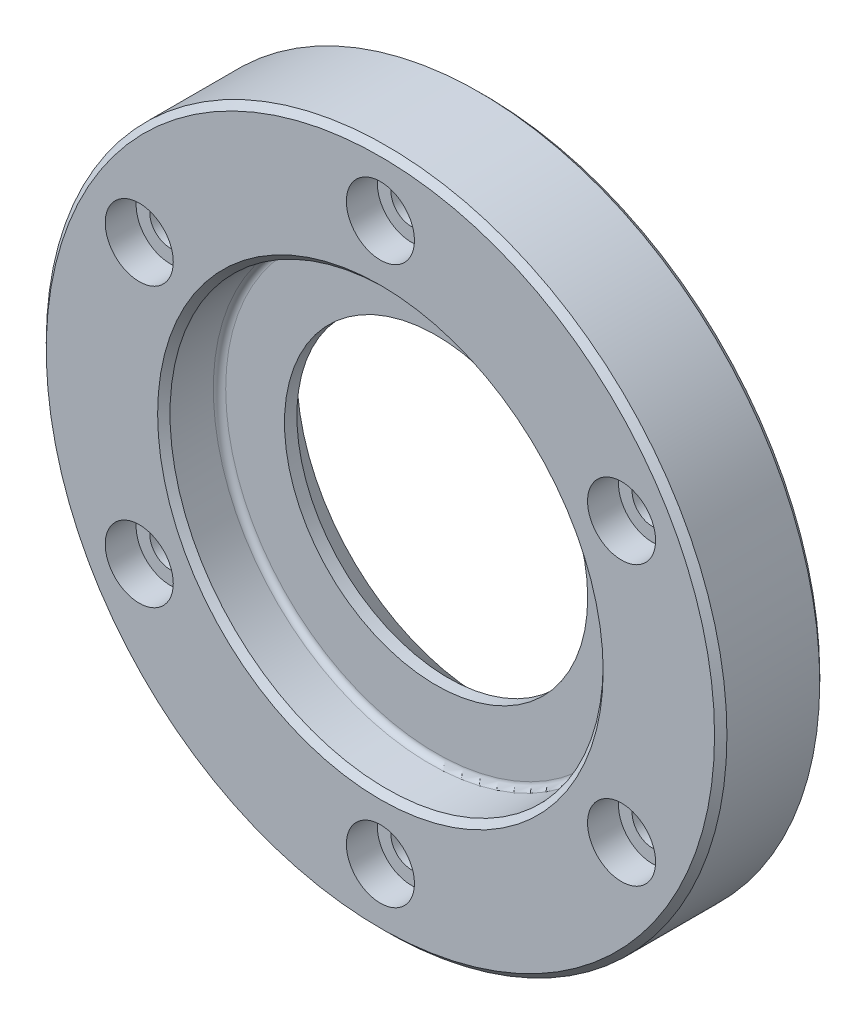
ISO-10303-21;
HEADER;
FILE_DESCRIPTION(('STEP AP214'),'2;1');
FILE_NAME('part.step','',(''),(''),'','','');
FILE_SCHEMA(('AUTOMOTIVE_DESIGN { 1 0 10303 214 1 1 1 1 }'));
ENDSEC;
DATA;
#1=APPLICATION_CONTEXT('core data for automotive mechanical design processes');
#2=APPLICATION_PROTOCOL_DEFINITION('international standard','automotive_design',2000,#1);
#3=PRODUCT_CONTEXT('',#1,'mechanical');
#4=PRODUCT('Part','Part','',(#3));
#5=PRODUCT_RELATED_PRODUCT_CATEGORY('part','',(#4));
#6=PRODUCT_DEFINITION_FORMATION('','',#4);
#7=PRODUCT_DEFINITION_CONTEXT('part definition',#1,'design');
#8=PRODUCT_DEFINITION('design','',#6,#7);
#9=PRODUCT_DEFINITION_SHAPE('','',#8);
#10=(LENGTH_UNIT() NAMED_UNIT(*) SI_UNIT(.MILLI.,.METRE.));
#11=(NAMED_UNIT(*) PLANE_ANGLE_UNIT() SI_UNIT($,.RADIAN.));
#12=(NAMED_UNIT(*) SI_UNIT($,.STERADIAN.) SOLID_ANGLE_UNIT());
#13=UNCERTAINTY_MEASURE_WITH_UNIT(LENGTH_MEASURE(1.E-05),#10,'distance_accuracy_value','');
#14=(GEOMETRIC_REPRESENTATION_CONTEXT(3) GLOBAL_UNCERTAINTY_ASSIGNED_CONTEXT((#13)) GLOBAL_UNIT_ASSIGNED_CONTEXT((#10,
#11,#12)) REPRESENTATION_CONTEXT('',''));
#15=CARTESIAN_POINT('',(0.,0.,0.));
#16=DIRECTION('',(0.,0.,1.));
#17=DIRECTION('',(1.,0.,0.));
#18=AXIS2_PLACEMENT_3D('',#15,#16,#17);
#19=CARTESIAN_POINT('',(0.,54.,0.));
#20=DIRECTION('',(0.,0.,-1.));
#21=DIRECTION('',(-1.,0.,0.));
#22=AXIS2_PLACEMENT_3D('',#19,#20,#21);
#23=PLANE('',#22);
#24=CARTESIAN_POINT('',(0.,-45.,0.));
#25=DIRECTION('',(0.,0.,1.));
#26=DIRECTION('',(1.,0.,0.));
#27=AXIS2_PLACEMENT_3D('',#24,#25,#26);
#28=CIRCLE('',#27,5.5);
#29=CARTESIAN_POINT('',(5.5,-45.,0.));
#30=VERTEX_POINT('',#29);
#31=EDGE_CURVE('E155',#30,#30,#28,.T.);
#32=ORIENTED_EDGE('',*,*,#31,.F.);
#33=EDGE_LOOP('',(#32));
#34=FACE_BOUND('',#33,.T.);
#35=CARTESIAN_POINT('',(-38.9711431702998,22.4999999999999,0.));
#36=DIRECTION('',(0.,0.,1.));
#37=DIRECTION('',(1.,0.,0.));
#38=AXIS2_PLACEMENT_3D('',#35,#36,#37);
#39=CIRCLE('',#38,5.5);
#40=CARTESIAN_POINT('',(-33.4711431702998,22.4999999999999,0.));
#41=VERTEX_POINT('',#40);
#42=EDGE_CURVE('E123',#41,#41,#39,.T.);
#43=ORIENTED_EDGE('',*,*,#42,.F.);
#44=EDGE_LOOP('',(#43));
#45=FACE_BOUND('',#44,.T.);
#46=CARTESIAN_POINT('',(0.,0.,0.));
#47=DIRECTION('',(0.,0.,1.));
#48=DIRECTION('',(1.,0.,0.));
#49=AXIS2_PLACEMENT_3D('',#46,#47,#48);
#50=CIRCLE('',#49,36.);
#51=CARTESIAN_POINT('',(36.,0.,0.));
#52=VERTEX_POINT('',#51);
#53=EDGE_CURVE('E61',#52,#52,#50,.T.);
#54=ORIENTED_EDGE('',*,*,#53,.F.);
#55=EDGE_LOOP('',(#54));
#56=FACE_BOUND('',#55,.T.);
#57=CARTESIAN_POINT('',(0.,0.,0.));
#58=DIRECTION('',(0.,0.,1.));
#59=DIRECTION('',(1.,0.,0.));
#60=AXIS2_PLACEMENT_3D('',#57,#58,#59);
#61=CIRCLE('',#60,54.);
#62=CARTESIAN_POINT('',(54.,0.,0.));
#63=VERTEX_POINT('',#62);
#64=EDGE_CURVE('E67',#63,#63,#61,.T.);
#65=ORIENTED_EDGE('',*,*,#64,.T.);
#66=EDGE_LOOP('',(#65));
#67=FACE_BOUND('',#66,.T.);
#68=CARTESIAN_POINT('',(0.,45.,0.));
#69=DIRECTION('',(0.,0.,1.));
#70=DIRECTION('',(1.,0.,0.));
#71=AXIS2_PLACEMENT_3D('',#68,#69,#70);
#72=CIRCLE('',#71,5.5);
#73=CARTESIAN_POINT('',(5.5,45.,0.));
#74=VERTEX_POINT('',#73);
#75=EDGE_CURVE('E107',#74,#74,#72,.T.);
#76=ORIENTED_EDGE('',*,*,#75,.F.);
#77=EDGE_LOOP('',(#76));
#78=FACE_BOUND('',#77,.T.);
#79=CARTESIAN_POINT('',(-38.9711431702996,-22.5000000000002,0.));
#80=DIRECTION('',(0.,0.,1.));
#81=DIRECTION('',(1.,0.,0.));
#82=AXIS2_PLACEMENT_3D('',#79,#80,#81);
#83=CIRCLE('',#82,5.5);
#84=CARTESIAN_POINT('',(-33.4711431702996,-22.5000000000002,0.));
#85=VERTEX_POINT('',#84);
#86=EDGE_CURVE('E139',#85,#85,#83,.T.);
#87=ORIENTED_EDGE('',*,*,#86,.F.);
#88=EDGE_LOOP('',(#87));
#89=FACE_BOUND('',#88,.T.);
#90=CARTESIAN_POINT('',(38.9711431702999,-22.4999999999996,0.));
#91=DIRECTION('',(0.,0.,1.));
#92=DIRECTION('',(1.,0.,0.));
#93=AXIS2_PLACEMENT_3D('',#90,#91,#92);
#94=CIRCLE('',#93,5.5);
#95=CARTESIAN_POINT('',(44.4711431702999,-22.4999999999996,0.));
#96=VERTEX_POINT('',#95);
#97=EDGE_CURVE('E171',#96,#96,#94,.T.);
#98=ORIENTED_EDGE('',*,*,#97,.F.);
#99=EDGE_LOOP('',(#98));
#100=FACE_BOUND('',#99,.T.);
#101=CARTESIAN_POINT('',(38.9711431702995,22.5000000000005,0.));
#102=DIRECTION('',(0.,0.,1.));
#103=DIRECTION('',(1.,0.,0.));
#104=AXIS2_PLACEMENT_3D('',#101,#102,#103);
#105=CIRCLE('',#104,5.5);
#106=CARTESIAN_POINT('',(44.4711431702995,22.5000000000005,0.));
#107=VERTEX_POINT('',#106);
#108=EDGE_CURVE('E187',#107,#107,#105,.T.);
#109=ORIENTED_EDGE('',*,*,#108,.F.);
#110=EDGE_LOOP('',(#109));
#111=FACE_BOUND('',#110,.T.);
#112=ADVANCED_FACE('F43',(#34,#45,#56,#67,#78,#89,#100,#111),#23,.F.);
#113=CARTESIAN_POINT('',(0.,34.,-9.00000000000001));
#114=DIRECTION('',(0.,0.,-1.));
#115=DIRECTION('',(-1.,0.,0.));
#116=AXIS2_PLACEMENT_3D('',#113,#114,#115);
#117=PLANE('',#116);
#118=CARTESIAN_POINT('',(0.,0.,-9.00000000000001));
#119=DIRECTION('',(0.,0.,1.));
#120=DIRECTION('',(1.,0.,0.));
#121=AXIS2_PLACEMENT_3D('',#118,#119,#120);
#122=CIRCLE('',#121,24.5);
#123=CARTESIAN_POINT('',(24.5,0.,-9.00000000000001));
#124=VERTEX_POINT('',#123);
#125=EDGE_CURVE('E91',#124,#124,#122,.T.);
#126=ORIENTED_EDGE('',*,*,#125,.F.);
#127=EDGE_LOOP('',(#126));
#128=FACE_BOUND('',#127,.T.);
#129=CARTESIAN_POINT('',(0.,0.,-9.00000000000001));
#130=DIRECTION('',(0.,0.,1.));
#131=DIRECTION('',(1.,0.,0.));
#132=AXIS2_PLACEMENT_3D('',#129,#130,#131);
#133=CIRCLE('',#132,34.);
#134=CARTESIAN_POINT('',(34.,0.,-9.00000000000001));
#135=VERTEX_POINT('',#134);
#136=EDGE_CURVE('E10',#135,#135,#133,.T.);
#137=ORIENTED_EDGE('',*,*,#136,.T.);
#138=EDGE_LOOP('',(#137));
#139=FACE_BOUND('',#138,.T.);
#140=ADVANCED_FACE('F45',(#128,#139),#117,.F.);
#141=CARTESIAN_POINT('',(0.,0.,-8.00000000000001));
#142=DIRECTION('',(0.,0.,1.));
#143=DIRECTION('',(1.,0.,0.));
#144=AXIS2_PLACEMENT_3D('',#141,#142,#143);
#145=TOROIDAL_SURFACE('',#144,34.,1.);
#146=ORIENTED_EDGE('',*,*,#136,.F.);
#147=EDGE_LOOP('',(#146));
#148=FACE_BOUND('',#147,.T.);
#149=CARTESIAN_POINT('',(0.,0.,-8.));
#150=DIRECTION('',(0.,0.,1.));
#151=DIRECTION('',(1.,0.,0.));
#152=AXIS2_PLACEMENT_3D('',#149,#150,#151);
#153=CIRCLE('',#152,35.);
#154=CARTESIAN_POINT('',(35.,0.,-8.));
#155=VERTEX_POINT('',#154);
#156=EDGE_CURVE('E51',#155,#155,#153,.T.);
#157=ORIENTED_EDGE('',*,*,#156,.T.);
#158=EDGE_LOOP('',(#157));
#159=FACE_BOUND('',#158,.T.);
#160=ADVANCED_FACE('F200',(#148,#159),#145,.F.);
#161=CARTESIAN_POINT('',(0.,0.,0.));
#162=DIRECTION('',(0.,0.,1.));
#163=DIRECTION('',(1.,0.,0.));
#164=AXIS2_PLACEMENT_3D('',#161,#162,#163);
#165=CYLINDRICAL_SURFACE('',#164,35.);
#166=ORIENTED_EDGE('',*,*,#156,.F.);
#167=EDGE_LOOP('',(#166));
#168=FACE_BOUND('',#167,.T.);
#169=CARTESIAN_POINT('',(0.,0.,-1.));
#170=DIRECTION('',(0.,0.,1.));
#171=DIRECTION('',(1.,0.,0.));
#172=AXIS2_PLACEMENT_3D('',#169,#170,#171);
#173=CIRCLE('',#172,35.);
#174=CARTESIAN_POINT('',(35.,0.,-1.));
#175=VERTEX_POINT('',#174);
#176=EDGE_CURVE('E56',#175,#175,#173,.T.);
#177=ORIENTED_EDGE('',*,*,#176,.T.);
#178=EDGE_LOOP('',(#177));
#179=FACE_BOUND('',#178,.T.);
#180=ADVANCED_FACE('F211',(#168,#179),#165,.F.);
#181=CARTESIAN_POINT('',(0.,0.,0.));
#182=DIRECTION('',(0.,0.,1.));
#183=DIRECTION('',(1.,0.,0.));
#184=AXIS2_PLACEMENT_3D('',#181,#182,#183);
#185=CONICAL_SURFACE('',#184,36.,0.785398163397449);
#186=ORIENTED_EDGE('',*,*,#176,.F.);
#187=EDGE_LOOP('',(#186));
#188=FACE_BOUND('',#187,.T.);
#189=ORIENTED_EDGE('',*,*,#53,.T.);
#190=EDGE_LOOP('',(#189));
#191=FACE_BOUND('',#190,.T.);
#192=ADVANCED_FACE('F208',(#188,#191),#185,.F.);
#193=CARTESIAN_POINT('',(0.,0.,-1.));
#194=DIRECTION('',(0.,0.,-1.));
#195=DIRECTION('',(-1.,0.,0.));
#196=AXIS2_PLACEMENT_3D('',#193,#194,#195);
#197=CONICAL_SURFACE('',#196,55.,0.785398163397449);
#198=ORIENTED_EDGE('',*,*,#64,.F.);
#199=EDGE_LOOP('',(#198));
#200=FACE_BOUND('',#199,.T.);
#201=CARTESIAN_POINT('',(0.,0.,-1.));
#202=DIRECTION('',(0.,0.,1.));
#203=DIRECTION('',(1.,0.,0.));
#204=AXIS2_PLACEMENT_3D('',#201,#202,#203);
#205=CIRCLE('',#204,55.);
#206=CARTESIAN_POINT('',(55.,0.,-1.));
#207=VERTEX_POINT('',#206);
#208=EDGE_CURVE('E71',#207,#207,#205,.T.);
#209=ORIENTED_EDGE('',*,*,#208,.T.);
#210=EDGE_LOOP('',(#209));
#211=FACE_BOUND('',#210,.T.);
#212=ADVANCED_FACE('F206',(#200,#211),#197,.T.);
#213=CARTESIAN_POINT('',(0.,0.,0.));
#214=DIRECTION('',(0.,0.,1.));
#215=DIRECTION('',(1.,0.,0.));
#216=AXIS2_PLACEMENT_3D('',#213,#214,#215);
#217=CYLINDRICAL_SURFACE('',#216,55.);
#218=ORIENTED_EDGE('',*,*,#208,.F.);
#219=EDGE_LOOP('',(#218));
#220=FACE_BOUND('',#219,.T.);
#221=CARTESIAN_POINT('',(0.,0.,-16.));
#222=DIRECTION('',(0.,0.,1.));
#223=DIRECTION('',(1.,0.,0.));
#224=AXIS2_PLACEMENT_3D('',#221,#222,#223);
#225=CIRCLE('',#224,55.);
#226=CARTESIAN_POINT('',(55.,0.,-16.));
#227=VERTEX_POINT('',#226);
#228=EDGE_CURVE('E75',#227,#227,#225,.T.);
#229=ORIENTED_EDGE('',*,*,#228,.T.);
#230=EDGE_LOOP('',(#229));
#231=FACE_BOUND('',#230,.T.);
#232=ADVANCED_FACE('F236',(#220,#231),#217,.T.);
#233=CARTESIAN_POINT('',(0.,0.,-17.));
#234=DIRECTION('',(0.,0.,1.));
#235=DIRECTION('',(1.,0.,0.));
#236=AXIS2_PLACEMENT_3D('',#233,#234,#235);
#237=CONICAL_SURFACE('',#236,54.,0.785398163397448);
#238=ORIENTED_EDGE('',*,*,#228,.F.);
#239=EDGE_LOOP('',(#238));
#240=FACE_BOUND('',#239,.T.);
#241=CARTESIAN_POINT('',(0.,0.,-17.));
#242=DIRECTION('',(0.,0.,1.));
#243=DIRECTION('',(1.,0.,0.));
#244=AXIS2_PLACEMENT_3D('',#241,#242,#243);
#245=CIRCLE('',#244,54.);
#246=CARTESIAN_POINT('',(54.,0.,-17.));
#247=VERTEX_POINT('',#246);
#248=EDGE_CURVE('E79',#247,#247,#245,.T.);
#249=ORIENTED_EDGE('',*,*,#248,.T.);
#250=EDGE_LOOP('',(#249));
#251=FACE_BOUND('',#250,.T.);
#252=ADVANCED_FACE('F243',(#240,#251),#237,.T.);
#253=CARTESIAN_POINT('',(0.,30.5,-17.));
#254=DIRECTION('',(0.,0.,1.));
#255=DIRECTION('',(1.,0.,0.));
#256=AXIS2_PLACEMENT_3D('',#253,#254,#255);
#257=PLANE('',#256);
#258=CARTESIAN_POINT('',(38.9711431702995,22.5000000000005,-17.));
#259=DIRECTION('',(0.,0.,1.));
#260=DIRECTION('',(1.,0.,0.));
#261=AXIS2_PLACEMENT_3D('',#258,#259,#260);
#262=CIRCLE('',#261,3.3);
#263=CARTESIAN_POINT('',(42.2711431702995,22.5000000000005,-17.));
#264=VERTEX_POINT('',#263);
#265=EDGE_CURVE('E175',#264,#264,#262,.T.);
#266=ORIENTED_EDGE('',*,*,#265,.T.);
#267=EDGE_LOOP('',(#266));
#268=FACE_BOUND('',#267,.T.);
#269=CARTESIAN_POINT('',(38.9711431702999,-22.4999999999996,-17.));
#270=DIRECTION('',(0.,0.,1.));
#271=DIRECTION('',(1.,0.,0.));
#272=AXIS2_PLACEMENT_3D('',#269,#270,#271);
#273=CIRCLE('',#272,3.3);
#274=CARTESIAN_POINT('',(42.2711431703,-22.4999999999996,-17.));
#275=VERTEX_POINT('',#274);
#276=EDGE_CURVE('E159',#275,#275,#273,.T.);
#277=ORIENTED_EDGE('',*,*,#276,.T.);
#278=EDGE_LOOP('',(#277));
#279=FACE_BOUND('',#278,.T.);
#280=CARTESIAN_POINT('',(0.,-45.,-17.));
#281=DIRECTION('',(0.,0.,1.));
#282=DIRECTION('',(1.,0.,0.));
#283=AXIS2_PLACEMENT_3D('',#280,#281,#282);
#284=CIRCLE('',#283,3.3);
#285=CARTESIAN_POINT('',(3.3,-45.,-17.));
#286=VERTEX_POINT('',#285);
#287=EDGE_CURVE('E143',#286,#286,#284,.T.);
#288=ORIENTED_EDGE('',*,*,#287,.T.);
#289=EDGE_LOOP('',(#288));
#290=FACE_BOUND('',#289,.T.);
#291=CARTESIAN_POINT('',(-38.9711431702996,-22.5000000000002,-17.));
#292=DIRECTION('',(0.,0.,1.));
#293=DIRECTION('',(1.,0.,0.));
#294=AXIS2_PLACEMENT_3D('',#291,#292,#293);
#295=CIRCLE('',#294,3.3);
#296=CARTESIAN_POINT('',(-35.6711431702996,-22.5000000000002,-17.));
#297=VERTEX_POINT('',#296);
#298=EDGE_CURVE('E127',#297,#297,#295,.T.);
#299=ORIENTED_EDGE('',*,*,#298,.T.);
#300=EDGE_LOOP('',(#299));
#301=FACE_BOUND('',#300,.T.);
#302=CARTESIAN_POINT('',(-38.9711431702998,22.4999999999999,-17.));
#303=DIRECTION('',(0.,0.,1.));
#304=DIRECTION('',(1.,0.,0.));
#305=AXIS2_PLACEMENT_3D('',#302,#303,#304);
#306=CIRCLE('',#305,3.3);
#307=CARTESIAN_POINT('',(-35.6711431702998,22.4999999999999,-17.));
#308=VERTEX_POINT('',#307);
#309=EDGE_CURVE('E111',#308,#308,#306,.T.);
#310=ORIENTED_EDGE('',*,*,#309,.T.);
#311=EDGE_LOOP('',(#310));
#312=FACE_BOUND('',#311,.T.);
#313=CARTESIAN_POINT('',(0.,45.,-17.));
#314=DIRECTION('',(0.,0.,1.));
#315=DIRECTION('',(1.,0.,0.));
#316=AXIS2_PLACEMENT_3D('',#313,#314,#315);
#317=CIRCLE('',#316,3.3);
#318=CARTESIAN_POINT('',(3.3,45.,-17.));
#319=VERTEX_POINT('',#318);
#320=EDGE_CURVE('E95',#319,#319,#317,.T.);
#321=ORIENTED_EDGE('',*,*,#320,.T.);
#322=EDGE_LOOP('',(#321));
#323=FACE_BOUND('',#322,.T.);
#324=ORIENTED_EDGE('',*,*,#248,.F.);
#325=EDGE_LOOP('',(#324));
#326=FACE_BOUND('',#325,.T.);
#327=CARTESIAN_POINT('',(0.,0.,-17.));
#328=DIRECTION('',(0.,0.,1.));
#329=DIRECTION('',(1.,0.,0.));
#330=AXIS2_PLACEMENT_3D('',#327,#328,#329);
#331=CIRCLE('',#330,30.5);
#332=CARTESIAN_POINT('',(30.5,0.,-17.));
#333=VERTEX_POINT('',#332);
#334=EDGE_CURVE('E83',#333,#333,#331,.T.);
#335=ORIENTED_EDGE('',*,*,#334,.T.);
#336=EDGE_LOOP('',(#335));
#337=FACE_BOUND('',#336,.T.);
#338=ADVANCED_FACE('F251',(#268,#279,#290,#301,#312,#323,#326,#337),#257,.F.);
#339=CARTESIAN_POINT('',(0.,0.,-11.));
#340=DIRECTION('',(0.,0.,-1.));
#341=DIRECTION('',(-1.,0.,0.));
#342=AXIS2_PLACEMENT_3D('',#339,#340,#341);
#343=CONICAL_SURFACE('',#342,24.5,0.785398163397448);
#344=ORIENTED_EDGE('',*,*,#334,.F.);
#345=EDGE_LOOP('',(#344));
#346=FACE_BOUND('',#345,.T.);
#347=CARTESIAN_POINT('',(0.,0.,-11.));
#348=DIRECTION('',(0.,0.,1.));
#349=DIRECTION('',(1.,0.,0.));
#350=AXIS2_PLACEMENT_3D('',#347,#348,#349);
#351=CIRCLE('',#350,24.5);
#352=CARTESIAN_POINT('',(24.5,0.,-11.));
#353=VERTEX_POINT('',#352);
#354=EDGE_CURVE('E87',#353,#353,#351,.T.);
#355=ORIENTED_EDGE('',*,*,#354,.T.);
#356=EDGE_LOOP('',(#355));
#357=FACE_BOUND('',#356,.T.);
#358=ADVANCED_FACE('F259',(#346,#357),#343,.F.);
#359=CARTESIAN_POINT('',(0.,0.,0.));
#360=DIRECTION('',(0.,0.,1.));
#361=DIRECTION('',(1.,0.,0.));
#362=AXIS2_PLACEMENT_3D('',#359,#360,#361);
#363=CYLINDRICAL_SURFACE('',#362,24.5);
#364=ORIENTED_EDGE('',*,*,#354,.F.);
#365=EDGE_LOOP('',(#364));
#366=FACE_BOUND('',#365,.T.);
#367=ORIENTED_EDGE('',*,*,#125,.T.);
#368=EDGE_LOOP('',(#367));
#369=FACE_BOUND('',#368,.T.);
#370=ADVANCED_FACE('F266',(#366,#369),#363,.F.);
#371=CARTESIAN_POINT('',(0.,45.,0.));
#372=DIRECTION('',(0.,0.,1.));
#373=DIRECTION('',(1.,0.,0.));
#374=AXIS2_PLACEMENT_3D('',#371,#372,#373);
#375=CYLINDRICAL_SURFACE('',#374,3.3);
#376=ORIENTED_EDGE('',*,*,#320,.F.);
#377=EDGE_LOOP('',(#376));
#378=FACE_BOUND('',#377,.T.);
#379=CARTESIAN_POINT('',(0.,45.,-5.));
#380=DIRECTION('',(0.,0.,1.));
#381=DIRECTION('',(1.,0.,0.));
#382=AXIS2_PLACEMENT_3D('',#379,#380,#381);
#383=CIRCLE('',#382,3.30000000000001);
#384=CARTESIAN_POINT('',(3.30000000000001,45.,-5.));
#385=VERTEX_POINT('',#384);
#386=EDGE_CURVE('E99',#385,#385,#383,.T.);
#387=ORIENTED_EDGE('',*,*,#386,.T.);
#388=EDGE_LOOP('',(#387));
#389=FACE_BOUND('',#388,.T.);
#390=ADVANCED_FACE('F274',(#378,#389),#375,.F.);
#391=CARTESIAN_POINT('',(3.30000000000001,45.,-5.));
#392=DIRECTION('',(0.,0.,-1.));
#393=DIRECTION('',(-1.,0.,0.));
#394=AXIS2_PLACEMENT_3D('',#391,#392,#393);
#395=PLANE('',#394);
#396=ORIENTED_EDGE('',*,*,#386,.F.);
#397=EDGE_LOOP('',(#396));
#398=FACE_BOUND('',#397,.T.);
#399=CARTESIAN_POINT('',(0.,45.,-5.));
#400=DIRECTION('',(0.,0.,1.));
#401=DIRECTION('',(1.,0.,0.));
#402=AXIS2_PLACEMENT_3D('',#399,#400,#401);
#403=CIRCLE('',#402,5.5);
#404=CARTESIAN_POINT('',(5.5,45.,-5.));
#405=VERTEX_POINT('',#404);
#406=EDGE_CURVE('E103',#405,#405,#403,.T.);
#407=ORIENTED_EDGE('',*,*,#406,.T.);
#408=EDGE_LOOP('',(#407));
#409=FACE_BOUND('',#408,.T.);
#410=ADVANCED_FACE('F282',(#398,#409),#395,.F.);
#411=CARTESIAN_POINT('',(0.,45.,0.));
#412=DIRECTION('',(0.,0.,1.));
#413=DIRECTION('',(1.,0.,0.));
#414=AXIS2_PLACEMENT_3D('',#411,#412,#413);
#415=CYLINDRICAL_SURFACE('',#414,5.5);
#416=ORIENTED_EDGE('',*,*,#406,.F.);
#417=EDGE_LOOP('',(#416));
#418=FACE_BOUND('',#417,.T.);
#419=ORIENTED_EDGE('',*,*,#75,.T.);
#420=EDGE_LOOP('',(#419));
#421=FACE_BOUND('',#420,.T.);
#422=ADVANCED_FACE('F290',(#418,#421),#415,.F.);
#423=CARTESIAN_POINT('',(-38.9711431702998,22.4999999999999,0.));
#424=DIRECTION('',(0.,0.,1.));
#425=DIRECTION('',(1.,0.,0.));
#426=AXIS2_PLACEMENT_3D('',#423,#424,#425);
#427=CYLINDRICAL_SURFACE('',#426,3.3);
#428=ORIENTED_EDGE('',*,*,#309,.F.);
#429=EDGE_LOOP('',(#428));
#430=FACE_BOUND('',#429,.T.);
#431=CARTESIAN_POINT('',(-38.9711431702998,22.4999999999999,-5.));
#432=DIRECTION('',(0.,0.,1.));
#433=DIRECTION('',(1.,0.,0.));
#434=AXIS2_PLACEMENT_3D('',#431,#432,#433);
#435=CIRCLE('',#434,3.3);
#436=CARTESIAN_POINT('',(-35.6711431702998,22.4999999999999,-5.));
#437=VERTEX_POINT('',#436);
#438=EDGE_CURVE('E115',#437,#437,#435,.T.);
#439=ORIENTED_EDGE('',*,*,#438,.T.);
#440=EDGE_LOOP('',(#439));
#441=FACE_BOUND('',#440,.T.);
#442=ADVANCED_FACE('F298',(#430,#441),#427,.F.);
#443=CARTESIAN_POINT('',(-35.6711431702998,22.4999999999999,-5.));
#444=DIRECTION('',(0.,0.,-1.));
#445=DIRECTION('',(-1.,0.,0.));
#446=AXIS2_PLACEMENT_3D('',#443,#444,#445);
#447=PLANE('',#446);
#448=ORIENTED_EDGE('',*,*,#438,.F.);
#449=EDGE_LOOP('',(#448));
#450=FACE_BOUND('',#449,.T.);
#451=CARTESIAN_POINT('',(-38.9711431702998,22.4999999999999,-5.));
#452=DIRECTION('',(0.,0.,1.));
#453=DIRECTION('',(1.,0.,0.));
#454=AXIS2_PLACEMENT_3D('',#451,#452,#453);
#455=CIRCLE('',#454,5.5);
#456=CARTESIAN_POINT('',(-33.4711431702998,22.4999999999999,-5.));
#457=VERTEX_POINT('',#456);
#458=EDGE_CURVE('E119',#457,#457,#455,.T.);
#459=ORIENTED_EDGE('',*,*,#458,.T.);
#460=EDGE_LOOP('',(#459));
#461=FACE_BOUND('',#460,.T.);
#462=ADVANCED_FACE('F307',(#450,#461),#447,.F.);
#463=CARTESIAN_POINT('',(-38.9711431702998,22.4999999999999,0.));
#464=DIRECTION('',(0.,0.,1.));
#465=DIRECTION('',(1.,0.,0.));
#466=AXIS2_PLACEMENT_3D('',#463,#464,#465);
#467=CYLINDRICAL_SURFACE('',#466,5.5);
#468=ORIENTED_EDGE('',*,*,#458,.F.);
#469=EDGE_LOOP('',(#468));
#470=FACE_BOUND('',#469,.T.);
#471=ORIENTED_EDGE('',*,*,#42,.T.);
#472=EDGE_LOOP('',(#471));
#473=FACE_BOUND('',#472,.T.);
#474=ADVANCED_FACE('F315',(#470,#473),#467,.F.);
#475=CARTESIAN_POINT('',(-38.9711431702996,-22.5000000000002,0.));
#476=DIRECTION('',(0.,0.,1.));
#477=DIRECTION('',(1.,0.,0.));
#478=AXIS2_PLACEMENT_3D('',#475,#476,#477);
#479=CYLINDRICAL_SURFACE('',#478,3.3);
#480=ORIENTED_EDGE('',*,*,#298,.F.);
#481=EDGE_LOOP('',(#480));
#482=FACE_BOUND('',#481,.T.);
#483=CARTESIAN_POINT('',(-38.9711431702996,-22.5000000000002,-5.));
#484=DIRECTION('',(0.,0.,1.));
#485=DIRECTION('',(1.,0.,0.));
#486=AXIS2_PLACEMENT_3D('',#483,#484,#485);
#487=CIRCLE('',#486,3.3);
#488=CARTESIAN_POINT('',(-35.6711431702996,-22.5000000000002,-5.));
#489=VERTEX_POINT('',#488);
#490=EDGE_CURVE('E131',#489,#489,#487,.T.);
#491=ORIENTED_EDGE('',*,*,#490,.T.);
#492=EDGE_LOOP('',(#491));
#493=FACE_BOUND('',#492,.T.);
#494=ADVANCED_FACE('F323',(#482,#493),#479,.F.);
#495=CARTESIAN_POINT('',(-35.6711431702996,-22.5000000000002,-5.));
#496=DIRECTION('',(0.,0.,-1.));
#497=DIRECTION('',(-1.,0.,0.));
#498=AXIS2_PLACEMENT_3D('',#495,#496,#497);
#499=PLANE('',#498);
#500=ORIENTED_EDGE('',*,*,#490,.F.);
#501=EDGE_LOOP('',(#500));
#502=FACE_BOUND('',#501,.T.);
#503=CARTESIAN_POINT('',(-38.9711431702996,-22.5000000000002,-5.));
#504=DIRECTION('',(0.,0.,1.));
#505=DIRECTION('',(1.,0.,0.));
#506=AXIS2_PLACEMENT_3D('',#503,#504,#505);
#507=CIRCLE('',#506,5.5);
#508=CARTESIAN_POINT('',(-33.4711431702996,-22.5000000000002,-5.));
#509=VERTEX_POINT('',#508);
#510=EDGE_CURVE('E135',#509,#509,#507,.T.);
#511=ORIENTED_EDGE('',*,*,#510,.T.);
#512=EDGE_LOOP('',(#511));
#513=FACE_BOUND('',#512,.T.);
#514=ADVANCED_FACE('F331',(#502,#513),#499,.F.);
#515=CARTESIAN_POINT('',(-38.9711431702996,-22.5000000000002,0.));
#516=DIRECTION('',(0.,0.,1.));
#517=DIRECTION('',(1.,0.,0.));
#518=AXIS2_PLACEMENT_3D('',#515,#516,#517);
#519=CYLINDRICAL_SURFACE('',#518,5.5);
#520=ORIENTED_EDGE('',*,*,#510,.F.);
#521=EDGE_LOOP('',(#520));
#522=FACE_BOUND('',#521,.T.);
#523=ORIENTED_EDGE('',*,*,#86,.T.);
#524=EDGE_LOOP('',(#523));
#525=FACE_BOUND('',#524,.T.);
#526=ADVANCED_FACE('F339',(#522,#525),#519,.F.);
#527=CARTESIAN_POINT('',(0.,-45.,0.));
#528=DIRECTION('',(0.,0.,1.));
#529=DIRECTION('',(1.,0.,0.));
#530=AXIS2_PLACEMENT_3D('',#527,#528,#529);
#531=CYLINDRICAL_SURFACE('',#530,3.3);
#532=ORIENTED_EDGE('',*,*,#287,.F.);
#533=EDGE_LOOP('',(#532));
#534=FACE_BOUND('',#533,.T.);
#535=CARTESIAN_POINT('',(0.,-45.,-5.));
#536=DIRECTION('',(0.,0.,1.));
#537=DIRECTION('',(1.,0.,0.));
#538=AXIS2_PLACEMENT_3D('',#535,#536,#537);
#539=CIRCLE('',#538,3.30000000000001);
#540=CARTESIAN_POINT('',(3.30000000000001,-45.,-5.));
#541=VERTEX_POINT('',#540);
#542=EDGE_CURVE('E147',#541,#541,#539,.T.);
#543=ORIENTED_EDGE('',*,*,#542,.T.);
#544=EDGE_LOOP('',(#543));
#545=FACE_BOUND('',#544,.T.);
#546=ADVANCED_FACE('F347',(#534,#545),#531,.F.);
#547=CARTESIAN_POINT('',(3.30000000000001,-45.,-5.));
#548=DIRECTION('',(0.,0.,-1.));
#549=DIRECTION('',(-1.,0.,0.));
#550=AXIS2_PLACEMENT_3D('',#547,#548,#549);
#551=PLANE('',#550);
#552=ORIENTED_EDGE('',*,*,#542,.F.);
#553=EDGE_LOOP('',(#552));
#554=FACE_BOUND('',#553,.T.);
#555=CARTESIAN_POINT('',(0.,-45.,-5.));
#556=DIRECTION('',(0.,0.,1.));
#557=DIRECTION('',(1.,0.,0.));
#558=AXIS2_PLACEMENT_3D('',#555,#556,#557);
#559=CIRCLE('',#558,5.5);
#560=CARTESIAN_POINT('',(5.5,-45.,-5.));
#561=VERTEX_POINT('',#560);
#562=EDGE_CURVE('E151',#561,#561,#559,.T.);
#563=ORIENTED_EDGE('',*,*,#562,.T.);
#564=EDGE_LOOP('',(#563));
#565=FACE_BOUND('',#564,.T.);
#566=ADVANCED_FACE('F355',(#554,#565),#551,.F.);
#567=CARTESIAN_POINT('',(0.,-45.,0.));
#568=DIRECTION('',(0.,0.,1.));
#569=DIRECTION('',(1.,0.,0.));
#570=AXIS2_PLACEMENT_3D('',#567,#568,#569);
#571=CYLINDRICAL_SURFACE('',#570,5.5);
#572=ORIENTED_EDGE('',*,*,#562,.F.);
#573=EDGE_LOOP('',(#572));
#574=FACE_BOUND('',#573,.T.);
#575=ORIENTED_EDGE('',*,*,#31,.T.);
#576=EDGE_LOOP('',(#575));
#577=FACE_BOUND('',#576,.T.);
#578=ADVANCED_FACE('F363',(#574,#577),#571,.F.);
#579=CARTESIAN_POINT('',(38.9711431702999,-22.4999999999996,0.));
#580=DIRECTION('',(0.,0.,1.));
#581=DIRECTION('',(1.,0.,0.));
#582=AXIS2_PLACEMENT_3D('',#579,#580,#581);
#583=CYLINDRICAL_SURFACE('',#582,3.3);
#584=ORIENTED_EDGE('',*,*,#276,.F.);
#585=EDGE_LOOP('',(#584));
#586=FACE_BOUND('',#585,.T.);
#587=CARTESIAN_POINT('',(38.9711431702999,-22.4999999999996,-5.));
#588=DIRECTION('',(0.,0.,1.));
#589=DIRECTION('',(1.,0.,0.));
#590=AXIS2_PLACEMENT_3D('',#587,#588,#589);
#591=CIRCLE('',#590,3.3);
#592=CARTESIAN_POINT('',(42.2711431703,-22.4999999999996,-5.));
#593=VERTEX_POINT('',#592);
#594=EDGE_CURVE('E163',#593,#593,#591,.T.);
#595=ORIENTED_EDGE('',*,*,#594,.T.);
#596=EDGE_LOOP('',(#595));
#597=FACE_BOUND('',#596,.T.);
#598=ADVANCED_FACE('F371',(#586,#597),#583,.F.);
#599=CARTESIAN_POINT('',(42.2711431703,-22.4999999999996,-5.));
#600=DIRECTION('',(0.,0.,-1.));
#601=DIRECTION('',(-1.,0.,0.));
#602=AXIS2_PLACEMENT_3D('',#599,#600,#601);
#603=PLANE('',#602);
#604=ORIENTED_EDGE('',*,*,#594,.F.);
#605=EDGE_LOOP('',(#604));
#606=FACE_BOUND('',#605,.T.);
#607=CARTESIAN_POINT('',(38.9711431702999,-22.4999999999996,-5.));
#608=DIRECTION('',(0.,0.,1.));
#609=DIRECTION('',(1.,0.,0.));
#610=AXIS2_PLACEMENT_3D('',#607,#608,#609);
#611=CIRCLE('',#610,5.5);
#612=CARTESIAN_POINT('',(44.4711431702999,-22.4999999999996,-5.));
#613=VERTEX_POINT('',#612);
#614=EDGE_CURVE('E167',#613,#613,#611,.T.);
#615=ORIENTED_EDGE('',*,*,#614,.T.);
#616=EDGE_LOOP('',(#615));
#617=FACE_BOUND('',#616,.T.);
#618=ADVANCED_FACE('F379',(#606,#617),#603,.F.);
#619=CARTESIAN_POINT('',(38.9711431702999,-22.4999999999996,0.));
#620=DIRECTION('',(0.,0.,1.));
#621=DIRECTION('',(1.,0.,0.));
#622=AXIS2_PLACEMENT_3D('',#619,#620,#621);
#623=CYLINDRICAL_SURFACE('',#622,5.5);
#624=ORIENTED_EDGE('',*,*,#614,.F.);
#625=EDGE_LOOP('',(#624));
#626=FACE_BOUND('',#625,.T.);
#627=ORIENTED_EDGE('',*,*,#97,.T.);
#628=EDGE_LOOP('',(#627));
#629=FACE_BOUND('',#628,.T.);
#630=ADVANCED_FACE('F387',(#626,#629),#623,.F.);
#631=CARTESIAN_POINT('',(38.9711431702995,22.5000000000005,0.));
#632=DIRECTION('',(0.,0.,1.));
#633=DIRECTION('',(1.,0.,0.));
#634=AXIS2_PLACEMENT_3D('',#631,#632,#633);
#635=CYLINDRICAL_SURFACE('',#634,3.3);
#636=ORIENTED_EDGE('',*,*,#265,.F.);
#637=EDGE_LOOP('',(#636));
#638=FACE_BOUND('',#637,.T.);
#639=CARTESIAN_POINT('',(38.9711431702995,22.5000000000005,-5.));
#640=DIRECTION('',(0.,0.,1.));
#641=DIRECTION('',(1.,0.,0.));
#642=AXIS2_PLACEMENT_3D('',#639,#640,#641);
#643=CIRCLE('',#642,3.3);
#644=CARTESIAN_POINT('',(42.2711431702995,22.5000000000005,-5.));
#645=VERTEX_POINT('',#644);
#646=EDGE_CURVE('E179',#645,#645,#643,.T.);
#647=ORIENTED_EDGE('',*,*,#646,.T.);
#648=EDGE_LOOP('',(#647));
#649=FACE_BOUND('',#648,.T.);
#650=ADVANCED_FACE('F395',(#638,#649),#635,.F.);
#651=CARTESIAN_POINT('',(42.2711431702995,22.5000000000005,-5.));
#652=DIRECTION('',(0.,0.,-1.));
#653=DIRECTION('',(-1.,0.,0.));
#654=AXIS2_PLACEMENT_3D('',#651,#652,#653);
#655=PLANE('',#654);
#656=ORIENTED_EDGE('',*,*,#646,.F.);
#657=EDGE_LOOP('',(#656));
#658=FACE_BOUND('',#657,.T.);
#659=CARTESIAN_POINT('',(38.9711431702995,22.5000000000005,-5.));
#660=DIRECTION('',(0.,0.,1.));
#661=DIRECTION('',(1.,0.,0.));
#662=AXIS2_PLACEMENT_3D('',#659,#660,#661);
#663=CIRCLE('',#662,5.5);
#664=CARTESIAN_POINT('',(44.4711431702995,22.5000000000005,-5.));
#665=VERTEX_POINT('',#664);
#666=EDGE_CURVE('E183',#665,#665,#663,.T.);
#667=ORIENTED_EDGE('',*,*,#666,.T.);
#668=EDGE_LOOP('',(#667));
#669=FACE_BOUND('',#668,.T.);
#670=ADVANCED_FACE('F403',(#658,#669),#655,.F.);
#671=CARTESIAN_POINT('',(38.9711431702995,22.5000000000005,0.));
#672=DIRECTION('',(0.,0.,1.));
#673=DIRECTION('',(1.,0.,0.));
#674=AXIS2_PLACEMENT_3D('',#671,#672,#673);
#675=CYLINDRICAL_SURFACE('',#674,5.5);
#676=ORIENTED_EDGE('',*,*,#666,.F.);
#677=EDGE_LOOP('',(#676));
#678=FACE_BOUND('',#677,.T.);
#679=ORIENTED_EDGE('',*,*,#108,.T.);
#680=EDGE_LOOP('',(#679));
#681=FACE_BOUND('',#680,.T.);
#682=ADVANCED_FACE('F192',(#678,#681),#675,.F.);
#683=CLOSED_SHELL('',(#112,#140,#160,#180,#192,#212,#232,#252,#338,#358,#370,#390,#410,#422,
#442,#462,#474,#494,#514,#526,#546,#566,#578,#598,#618,#630,#650,#670,#682));
#684=MANIFOLD_SOLID_BREP('B2',#683);
#685=ADVANCED_BREP_SHAPE_REPRESENTATION('',(#18,#684),#14);
#686=SHAPE_DEFINITION_REPRESENTATION(#9,#685);
ENDSEC;
END-ISO-10303-21;
